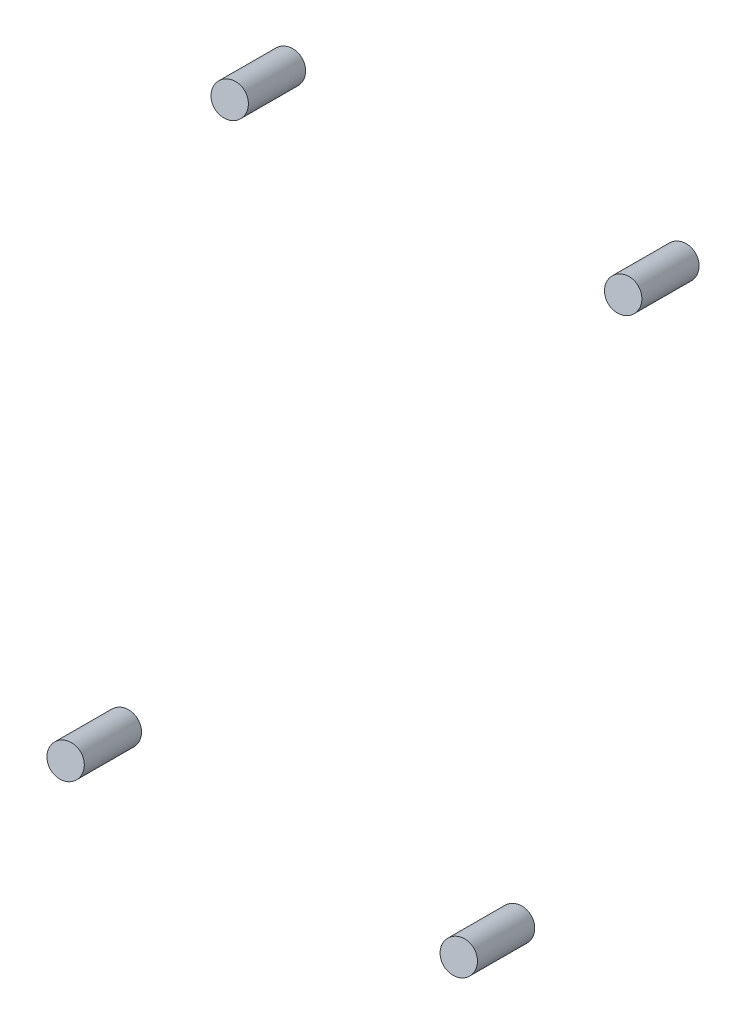
ISO-10303-21;
HEADER;
FILE_DESCRIPTION(('STEP AP214'),'2;1');
FILE_NAME('part.step','',(''),(''),'','','');
FILE_SCHEMA(('AUTOMOTIVE_DESIGN { 1 0 10303 214 1 1 1 1 }'));
ENDSEC;
DATA;
#1=APPLICATION_CONTEXT('core data for automotive mechanical design processes');
#2=APPLICATION_PROTOCOL_DEFINITION('international standard','automotive_design',2000,#1);
#3=PRODUCT_CONTEXT('',#1,'mechanical');
#4=PRODUCT('Part','Part','',(#3));
#5=PRODUCT_RELATED_PRODUCT_CATEGORY('part','',(#4));
#6=PRODUCT_DEFINITION_FORMATION('','',#4);
#7=PRODUCT_DEFINITION_CONTEXT('part definition',#1,'design');
#8=PRODUCT_DEFINITION('design','',#6,#7);
#9=PRODUCT_DEFINITION_SHAPE('','',#8);
#10=(LENGTH_UNIT() NAMED_UNIT(*) SI_UNIT(.MILLI.,.METRE.));
#11=(NAMED_UNIT(*) PLANE_ANGLE_UNIT() SI_UNIT($,.RADIAN.));
#12=(NAMED_UNIT(*) SI_UNIT($,.STERADIAN.) SOLID_ANGLE_UNIT());
#13=UNCERTAINTY_MEASURE_WITH_UNIT(LENGTH_MEASURE(1.E-05),#10,'distance_accuracy_value','');
#14=(GEOMETRIC_REPRESENTATION_CONTEXT(3) GLOBAL_UNCERTAINTY_ASSIGNED_CONTEXT((#13)) GLOBAL_UNIT_ASSIGNED_CONTEXT((#10,
#11,#12)) REPRESENTATION_CONTEXT('',''));
#15=CARTESIAN_POINT('',(0.,0.,0.));
#16=DIRECTION('',(0.,0.,1.));
#17=DIRECTION('',(1.,0.,0.));
#18=AXIS2_PLACEMENT_3D('',#15,#16,#17);
#19=CARTESIAN_POINT('',(176.470540709496,131.55531773929,-488.345983185074));
#20=DIRECTION('',(-0.21439677136806,-0.216048954630046,-0.952552819338758));
#21=DIRECTION('',(0.,0.975230185097804,-0.22119241866326));
#22=AXIS2_PLACEMENT_3D('',#19,#20,#21);
#23=CYLINDRICAL_SURFACE('',#22,2.00000000000002);
#24=CARTESIAN_POINT('',(176.470540709496,131.55531773929,-488.345983185074));
#25=DIRECTION('',(0.21439677136806,0.216048954630046,0.952552819338758));
#26=DIRECTION('',(0.,-0.975230185097804,0.22119241866326));
#27=AXIS2_PLACEMENT_3D('',#24,#25,#26);
#28=CIRCLE('',#27,2.00000000000002);
#29=CARTESIAN_POINT('',(176.470540709496,129.604857369094,-487.903598347747));
#30=VERTEX_POINT('',#29);
#31=EDGE_CURVE('E11',#30,#30,#28,.T.);
#32=ORIENTED_EDGE('',*,*,#31,.F.);
#33=EDGE_LOOP('',(#32));
#34=FACE_BOUND('',#33,.T.);
#35=CARTESIAN_POINT('',(174.326572995816,129.394828192989,-497.871511378461));
#36=DIRECTION('',(0.21439677136806,0.216048954630046,0.952552819338758));
#37=DIRECTION('',(0.,-0.975230185097804,0.22119241866326));
#38=AXIS2_PLACEMENT_3D('',#35,#36,#37);
#39=CIRCLE('',#38,2.00000000000002);
#40=CARTESIAN_POINT('',(174.326572995816,127.444367822794,-497.429126541135));
#41=VERTEX_POINT('',#40);
#42=EDGE_CURVE('E43',#41,#41,#39,.T.);
#43=ORIENTED_EDGE('',*,*,#42,.T.);
#44=EDGE_LOOP('',(#43));
#45=FACE_BOUND('',#44,.T.);
#46=ADVANCED_FACE('F40',(#34,#45),#23,.T.);
#47=CARTESIAN_POINT('',(176.470540709496,131.55531773929,-488.345983185074));
#48=DIRECTION('',(0.21439677136806,0.216048954630046,0.952552819338758));
#49=DIRECTION('',(0.,-0.975230185097804,0.22119241866326));
#50=AXIS2_PLACEMENT_3D('',#47,#48,#49);
#51=PLANE('',#50);
#52=ORIENTED_EDGE('',*,*,#31,.T.);
#53=EDGE_LOOP('',(#52));
#54=FACE_BOUND('',#53,.T.);
#55=ADVANCED_FACE('F55',(#54),#51,.T.);
#56=CARTESIAN_POINT('',(174.326572995816,129.394828192989,-497.871511378461));
#57=DIRECTION('',(0.21439677136806,0.216048954630046,0.952552819338758));
#58=DIRECTION('',(0.,-0.975230185097804,0.22119241866326));
#59=AXIS2_PLACEMENT_3D('',#56,#57,#58);
#60=PLANE('',#59);
#61=ORIENTED_EDGE('',*,*,#42,.F.);
#62=EDGE_LOOP('',(#61));
#63=FACE_BOUND('',#62,.T.);
#64=ADVANCED_FACE('F53',(#63),#60,.F.);
#65=CLOSED_SHELL('',(#46,#55,#64));
#66=MANIFOLD_SOLID_BREP('B2',#65);
#67=CARTESIAN_POINT('',(134.14643997764,136.515609088471,-479.944890222197));
#68=DIRECTION('',(-0.21439677136806,-0.216048954630046,-0.952552819338758));
#69=DIRECTION('',(0.,0.975230185097804,-0.22119241866326));
#70=AXIS2_PLACEMENT_3D('',#67,#68,#69);
#71=CYLINDRICAL_SURFACE('',#70,1.99999999999999);
#72=CARTESIAN_POINT('',(134.14643997764,136.515609088471,-479.944890222197));
#73=DIRECTION('',(0.21439677136806,0.216048954630046,0.952552819338758));
#74=DIRECTION('',(0.,-0.975230185097804,0.22119241866326));
#75=AXIS2_PLACEMENT_3D('',#72,#73,#74);
#76=CIRCLE('',#75,1.99999999999999);
#77=CARTESIAN_POINT('',(134.14643997764,134.565148718275,-479.50250538487));
#78=VERTEX_POINT('',#77);
#79=EDGE_CURVE('E39',#78,#78,#76,.T.);
#80=ORIENTED_EDGE('',*,*,#79,.F.);
#81=EDGE_LOOP('',(#80));
#82=FACE_BOUND('',#81,.T.);
#83=CARTESIAN_POINT('',(132.002472263959,134.355119542171,-489.470418415584));
#84=DIRECTION('',(0.21439677136806,0.216048954630046,0.952552819338758));
#85=DIRECTION('',(0.,-0.975230185097804,0.22119241866326));
#86=AXIS2_PLACEMENT_3D('',#83,#84,#85);
#87=CIRCLE('',#86,1.99999999999999);
#88=CARTESIAN_POINT('',(132.002472263959,132.404659171975,-489.028033578258));
#89=VERTEX_POINT('',#88);
#90=EDGE_CURVE('E92',#89,#89,#87,.T.);
#91=ORIENTED_EDGE('',*,*,#90,.T.);
#92=EDGE_LOOP('',(#91));
#93=FACE_BOUND('',#92,.T.);
#94=ADVANCED_FACE('F89',(#82,#93),#71,.T.);
#95=CARTESIAN_POINT('',(134.14643997764,136.515609088471,-479.944890222197));
#96=DIRECTION('',(0.21439677136806,0.216048954630046,0.952552819338758));
#97=DIRECTION('',(0.,-0.975230185097804,0.22119241866326));
#98=AXIS2_PLACEMENT_3D('',#95,#96,#97);
#99=PLANE('',#98);
#100=ORIENTED_EDGE('',*,*,#79,.T.);
#101=EDGE_LOOP('',(#100));
#102=FACE_BOUND('',#101,.T.);
#103=ADVANCED_FACE('F104',(#102),#99,.T.);
#104=CARTESIAN_POINT('',(132.002472263959,134.355119542171,-489.470418415584));
#105=DIRECTION('',(0.21439677136806,0.216048954630046,0.952552819338758));
#106=DIRECTION('',(0.,-0.975230185097804,0.22119241866326));
#107=AXIS2_PLACEMENT_3D('',#104,#105,#106);
#108=PLANE('',#107);
#109=ORIENTED_EDGE('',*,*,#90,.F.);
#110=EDGE_LOOP('',(#109));
#111=FACE_BOUND('',#110,.T.);
#112=ADVANCED_FACE('F102',(#111),#108,.F.);
#113=CLOSED_SHELL('',(#94,#103,#112));
#114=MANIFOLD_SOLID_BREP('B6',#113);
#115=CARTESIAN_POINT('',(181.175717209013,199.65695839127,-504.851170721633));
#116=DIRECTION('',(-0.21439677136806,-0.216048954630046,-0.952552819338758));
#117=DIRECTION('',(0.,0.975230185097804,-0.22119241866326));
#118=AXIS2_PLACEMENT_3D('',#115,#116,#117);
#119=CYLINDRICAL_SURFACE('',#118,2.);
#120=CARTESIAN_POINT('',(181.175717209013,199.65695839127,-504.851170721633));
#121=DIRECTION('',(0.21439677136806,0.216048954630046,0.952552819338758));
#122=DIRECTION('',(0.,-0.975230185097804,0.22119241866326));
#123=AXIS2_PLACEMENT_3D('',#120,#121,#122);
#124=CIRCLE('',#123,2.);
#125=CARTESIAN_POINT('',(181.175717209013,197.706498021074,-504.408785884307));
#126=VERTEX_POINT('',#125);
#127=EDGE_CURVE('E88',#126,#126,#124,.T.);
#128=ORIENTED_EDGE('',*,*,#127,.F.);
#129=EDGE_LOOP('',(#128));
#130=FACE_BOUND('',#129,.T.);
#131=CARTESIAN_POINT('',(179.031749495332,197.496468844969,-514.376698915021));
#132=DIRECTION('',(0.21439677136806,0.216048954630046,0.952552819338758));
#133=DIRECTION('',(0.,-0.975230185097804,0.22119241866326));
#134=AXIS2_PLACEMENT_3D('',#131,#132,#133);
#135=CIRCLE('',#134,2.);
#136=CARTESIAN_POINT('',(179.031749495332,195.546008474774,-513.934314077694));
#137=VERTEX_POINT('',#136);
#138=EDGE_CURVE('E140',#137,#137,#135,.T.);
#139=ORIENTED_EDGE('',*,*,#138,.T.);
#140=EDGE_LOOP('',(#139));
#141=FACE_BOUND('',#140,.T.);
#142=ADVANCED_FACE('F137',(#130,#141),#119,.T.);
#143=CARTESIAN_POINT('',(181.175717209013,199.65695839127,-504.851170721633));
#144=DIRECTION('',(0.21439677136806,0.216048954630046,0.952552819338758));
#145=DIRECTION('',(0.,-0.975230185097804,0.22119241866326));
#146=AXIS2_PLACEMENT_3D('',#143,#144,#145);
#147=PLANE('',#146);
#148=ORIENTED_EDGE('',*,*,#127,.T.);
#149=EDGE_LOOP('',(#148));
#150=FACE_BOUND('',#149,.T.);
#151=ADVANCED_FACE('F152',(#150),#147,.T.);
#152=CARTESIAN_POINT('',(179.031749495332,197.496468844969,-514.376698915021));
#153=DIRECTION('',(0.21439677136806,0.216048954630046,0.952552819338758));
#154=DIRECTION('',(0.,-0.975230185097804,0.22119241866326));
#155=AXIS2_PLACEMENT_3D('',#152,#153,#154);
#156=PLANE('',#155);
#157=ORIENTED_EDGE('',*,*,#138,.F.);
#158=EDGE_LOOP('',(#157));
#159=FACE_BOUND('',#158,.T.);
#160=ADVANCED_FACE('F150',(#159),#156,.F.);
#161=CLOSED_SHELL('',(#142,#151,#160));
#162=MANIFOLD_SOLID_BREP('B34',#161);
#163=CARTESIAN_POINT('',(138.843108020557,204.494100299851,-496.420231126683));
#164=DIRECTION('',(-0.21439677136806,-0.216048954630046,-0.952552819338758));
#165=DIRECTION('',(0.,0.975230185097804,-0.22119241866326));
#166=AXIS2_PLACEMENT_3D('',#163,#164,#165);
#167=CYLINDRICAL_SURFACE('',#166,1.99999999999999);
#168=CARTESIAN_POINT('',(138.843108020557,204.494100299851,-496.420231126683));
#169=DIRECTION('',(0.21439677136806,0.216048954630046,0.952552819338758));
#170=DIRECTION('',(0.,-0.975230185097804,0.22119241866326));
#171=AXIS2_PLACEMENT_3D('',#168,#169,#170);
#172=CIRCLE('',#171,1.99999999999999);
#173=CARTESIAN_POINT('',(138.843108020557,202.543639929655,-495.977846289356));
#174=VERTEX_POINT('',#173);
#175=EDGE_CURVE('E136',#174,#174,#172,.T.);
#176=ORIENTED_EDGE('',*,*,#175,.F.);
#177=EDGE_LOOP('',(#176));
#178=FACE_BOUND('',#177,.T.);
#179=CARTESIAN_POINT('',(136.699140306876,202.33361075355,-505.94575932007));
#180=DIRECTION('',(0.21439677136806,0.216048954630046,0.952552819338758));
#181=DIRECTION('',(0.,-0.975230185097804,0.22119241866326));
#182=AXIS2_PLACEMENT_3D('',#179,#180,#181);
#183=CIRCLE('',#182,1.99999999999999);
#184=CARTESIAN_POINT('',(136.699140306876,200.383150383354,-505.503374482744));
#185=VERTEX_POINT('',#184);
#186=EDGE_CURVE('E181',#185,#185,#183,.T.);
#187=ORIENTED_EDGE('',*,*,#186,.T.);
#188=EDGE_LOOP('',(#187));
#189=FACE_BOUND('',#188,.T.);
#190=ADVANCED_FACE('F178',(#178,#189),#167,.T.);
#191=CARTESIAN_POINT('',(138.843108020557,204.494100299851,-496.420231126683));
#192=DIRECTION('',(0.21439677136806,0.216048954630046,0.952552819338758));
#193=DIRECTION('',(0.,-0.975230185097804,0.22119241866326));
#194=AXIS2_PLACEMENT_3D('',#191,#192,#193);
#195=PLANE('',#194);
#196=ORIENTED_EDGE('',*,*,#175,.T.);
#197=EDGE_LOOP('',(#196));
#198=FACE_BOUND('',#197,.T.);
#199=ADVANCED_FACE('F193',(#198),#195,.T.);
#200=CARTESIAN_POINT('',(136.699140306876,202.33361075355,-505.94575932007));
#201=DIRECTION('',(0.21439677136806,0.216048954630046,0.952552819338758));
#202=DIRECTION('',(0.,-0.975230185097804,0.22119241866326));
#203=AXIS2_PLACEMENT_3D('',#200,#201,#202);
#204=PLANE('',#203);
#205=ORIENTED_EDGE('',*,*,#186,.F.);
#206=EDGE_LOOP('',(#205));
#207=FACE_BOUND('',#206,.T.);
#208=ADVANCED_FACE('F191',(#207),#204,.F.);
#209=CLOSED_SHELL('',(#190,#199,#208));
#210=MANIFOLD_SOLID_BREP('B83',#209);
#211=ADVANCED_BREP_SHAPE_REPRESENTATION('',(#18,#66,#114,#162,#210),#14);
#212=SHAPE_DEFINITION_REPRESENTATION(#9,#211);
ENDSEC;
END-ISO-10303-21;
